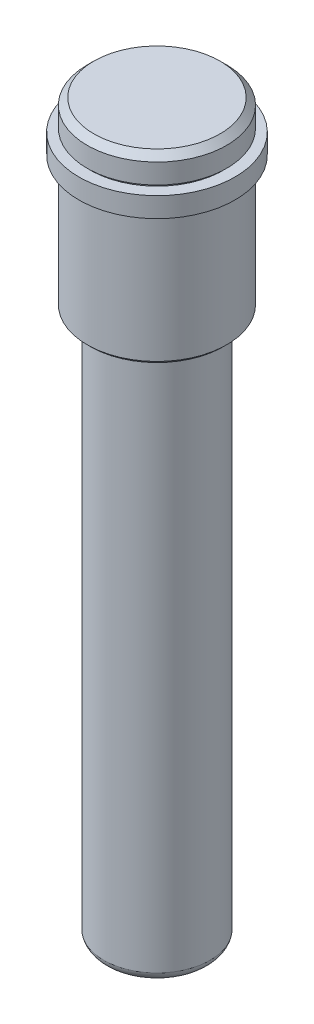
ISO-10303-21;
HEADER;
FILE_DESCRIPTION(('STEP AP214'),'2;1');
FILE_NAME('part.step','',(''),(''),'','','');
FILE_SCHEMA(('AUTOMOTIVE_DESIGN { 1 0 10303 214 1 1 1 1 }'));
ENDSEC;
DATA;
#1=APPLICATION_CONTEXT('core data for automotive mechanical design processes');
#2=APPLICATION_PROTOCOL_DEFINITION('international standard','automotive_design',2000,#1);
#3=PRODUCT_CONTEXT('',#1,'mechanical');
#4=PRODUCT('Part','Part','',(#3));
#5=PRODUCT_RELATED_PRODUCT_CATEGORY('part','',(#4));
#6=PRODUCT_DEFINITION_FORMATION('','',#4);
#7=PRODUCT_DEFINITION_CONTEXT('part definition',#1,'design');
#8=PRODUCT_DEFINITION('design','',#6,#7);
#9=PRODUCT_DEFINITION_SHAPE('','',#8);
#10=(LENGTH_UNIT() NAMED_UNIT(*) SI_UNIT(.MILLI.,.METRE.));
#11=(NAMED_UNIT(*) PLANE_ANGLE_UNIT() SI_UNIT($,.RADIAN.));
#12=(NAMED_UNIT(*) SI_UNIT($,.STERADIAN.) SOLID_ANGLE_UNIT());
#13=UNCERTAINTY_MEASURE_WITH_UNIT(LENGTH_MEASURE(1.E-05),#10,'distance_accuracy_value','');
#14=(GEOMETRIC_REPRESENTATION_CONTEXT(3) GLOBAL_UNCERTAINTY_ASSIGNED_CONTEXT((#13)) GLOBAL_UNIT_ASSIGNED_CONTEXT((#10,
#11,#12)) REPRESENTATION_CONTEXT('',''));
#15=CARTESIAN_POINT('',(0.,0.,0.));
#16=DIRECTION('',(0.,0.,1.));
#17=DIRECTION('',(1.,0.,0.));
#18=AXIS2_PLACEMENT_3D('',#15,#16,#17);
#19=CARTESIAN_POINT('',(0.,188.802213018916,0.));
#20=DIRECTION('',(0.,1.,0.));
#21=DIRECTION('',(-1.,0.,0.));
#22=AXIS2_PLACEMENT_3D('',#19,#20,#21);
#23=PLANE('',#22);
#24=CARTESIAN_POINT('',(0.,188.802213018916,0.));
#25=DIRECTION('',(0.,1.,0.));
#26=DIRECTION('',(-1.,0.,0.));
#27=AXIS2_PLACEMENT_3D('',#24,#25,#26);
#28=CIRCLE('',#27,19.);
#29=CARTESIAN_POINT('',(-19.,188.802213018916,0.));
#30=VERTEX_POINT('',#29);
#31=EDGE_CURVE('E10',#30,#30,#28,.T.);
#32=ORIENTED_EDGE('',*,*,#31,.T.);
#33=EDGE_LOOP('',(#32));
#34=FACE_BOUND('',#33,.T.);
#35=ADVANCED_FACE('F31',(#34),#23,.T.);
#36=CARTESIAN_POINT('',(0.,188.802213018916,0.));
#37=DIRECTION('',(0.,-1.,0.));
#38=DIRECTION('',(1.,0.,0.));
#39=AXIS2_PLACEMENT_3D('',#36,#37,#38);
#40=CONICAL_SURFACE('',#39,19.,0.785398163397447);
#41=CARTESIAN_POINT('',(0.,186.802213018916,0.));
#42=DIRECTION('',(0.,1.,0.));
#43=DIRECTION('',(-1.,0.,0.));
#44=AXIS2_PLACEMENT_3D('',#41,#42,#43);
#45=CIRCLE('',#44,21.);
#46=CARTESIAN_POINT('',(-21.,186.802213018916,0.));
#47=VERTEX_POINT('',#46);
#48=EDGE_CURVE('E37',#47,#47,#45,.T.);
#49=ORIENTED_EDGE('',*,*,#48,.T.);
#50=EDGE_LOOP('',(#49));
#51=FACE_BOUND('',#50,.T.);
#52=ORIENTED_EDGE('',*,*,#31,.F.);
#53=EDGE_LOOP('',(#52));
#54=FACE_BOUND('',#53,.T.);
#55=ADVANCED_FACE('F102',(#51,#54),#40,.T.);
#56=CARTESIAN_POINT('',(0.,188.802213018916,0.));
#57=DIRECTION('',(0.,1.,0.));
#58=DIRECTION('',(-1.,0.,0.));
#59=AXIS2_PLACEMENT_3D('',#56,#57,#58);
#60=CYLINDRICAL_SURFACE('',#59,21.);
#61=CARTESIAN_POINT('',(0.,180.802213018916,0.));
#62=DIRECTION('',(0.,1.,0.));
#63=DIRECTION('',(-1.,0.,0.));
#64=AXIS2_PLACEMENT_3D('',#61,#62,#63);
#65=CIRCLE('',#64,21.);
#66=CARTESIAN_POINT('',(-21.,180.802213018916,0.));
#67=VERTEX_POINT('',#66);
#68=EDGE_CURVE('E41',#67,#67,#65,.T.);
#69=ORIENTED_EDGE('',*,*,#68,.T.);
#70=EDGE_LOOP('',(#69));
#71=FACE_BOUND('',#70,.T.);
#72=ORIENTED_EDGE('',*,*,#48,.F.);
#73=EDGE_LOOP('',(#72));
#74=FACE_BOUND('',#73,.T.);
#75=ADVANCED_FACE('F106',(#71,#74),#60,.T.);
#76=CARTESIAN_POINT('',(-21.,180.802213018916,0.));
#77=DIRECTION('',(0.,-1.,0.));
#78=DIRECTION('',(1.,0.,0.));
#79=AXIS2_PLACEMENT_3D('',#76,#77,#78);
#80=PLANE('',#79);
#81=CARTESIAN_POINT('',(0.,180.802213018916,0.));
#82=DIRECTION('',(0.,1.,0.));
#83=DIRECTION('',(-1.,0.,0.));
#84=AXIS2_PLACEMENT_3D('',#81,#82,#83);
#85=CIRCLE('',#84,20.);
#86=CARTESIAN_POINT('',(-20.,180.802213018916,0.));
#87=VERTEX_POINT('',#86);
#88=EDGE_CURVE('E45',#87,#87,#85,.T.);
#89=ORIENTED_EDGE('',*,*,#88,.T.);
#90=EDGE_LOOP('',(#89));
#91=FACE_BOUND('',#90,.T.);
#92=ORIENTED_EDGE('',*,*,#68,.F.);
#93=EDGE_LOOP('',(#92));
#94=FACE_BOUND('',#93,.T.);
#95=ADVANCED_FACE('F110',(#91,#94),#80,.T.);
#96=CARTESIAN_POINT('',(0.,188.802213018916,0.));
#97=DIRECTION('',(0.,1.,0.));
#98=DIRECTION('',(-1.,0.,0.));
#99=AXIS2_PLACEMENT_3D('',#96,#97,#98);
#100=CYLINDRICAL_SURFACE('',#99,20.);
#101=CARTESIAN_POINT('',(0.,179.802213018916,0.));
#102=DIRECTION('',(0.,1.,0.));
#103=DIRECTION('',(-1.,0.,0.));
#104=AXIS2_PLACEMENT_3D('',#101,#102,#103);
#105=CIRCLE('',#104,20.);
#106=CARTESIAN_POINT('',(-20.,179.802213018916,0.));
#107=VERTEX_POINT('',#106);
#108=EDGE_CURVE('E50',#107,#107,#105,.T.);
#109=ORIENTED_EDGE('',*,*,#108,.T.);
#110=EDGE_LOOP('',(#109));
#111=FACE_BOUND('',#110,.T.);
#112=ORIENTED_EDGE('',*,*,#88,.F.);
#113=EDGE_LOOP('',(#112));
#114=FACE_BOUND('',#113,.T.);
#115=ADVANCED_FACE('F117',(#111,#114),#100,.T.);
#116=CARTESIAN_POINT('',(-20.,179.802213018916,0.));
#117=DIRECTION('',(0.,1.,0.));
#118=DIRECTION('',(-1.,0.,0.));
#119=AXIS2_PLACEMENT_3D('',#116,#117,#118);
#120=PLANE('',#119);
#121=CARTESIAN_POINT('',(0.,179.802213018916,0.));
#122=DIRECTION('',(0.,1.,0.));
#123=DIRECTION('',(-1.,0.,0.));
#124=AXIS2_PLACEMENT_3D('',#121,#122,#123);
#125=CIRCLE('',#124,23.5);
#126=CARTESIAN_POINT('',(-23.5,179.802213018916,0.));
#127=VERTEX_POINT('',#126);
#128=EDGE_CURVE('E53',#127,#127,#125,.T.);
#129=ORIENTED_EDGE('',*,*,#128,.T.);
#130=EDGE_LOOP('',(#129));
#131=FACE_BOUND('',#130,.T.);
#132=ORIENTED_EDGE('',*,*,#108,.F.);
#133=EDGE_LOOP('',(#132));
#134=FACE_BOUND('',#133,.T.);
#135=ADVANCED_FACE('F121',(#131,#134),#120,.T.);
#136=CARTESIAN_POINT('',(0.,188.802213018916,0.));
#137=DIRECTION('',(0.,1.,0.));
#138=DIRECTION('',(-1.,0.,0.));
#139=AXIS2_PLACEMENT_3D('',#136,#137,#138);
#140=CYLINDRICAL_SURFACE('',#139,23.5);
#141=CARTESIAN_POINT('',(0.,173.802213018916,0.));
#142=DIRECTION('',(0.,1.,0.));
#143=DIRECTION('',(-1.,0.,0.));
#144=AXIS2_PLACEMENT_3D('',#141,#142,#143);
#145=CIRCLE('',#144,23.5);
#146=CARTESIAN_POINT('',(-23.5,173.802213018916,0.));
#147=VERTEX_POINT('',#146);
#148=EDGE_CURVE('E56',#147,#147,#145,.T.);
#149=ORIENTED_EDGE('',*,*,#148,.T.);
#150=EDGE_LOOP('',(#149));
#151=FACE_BOUND('',#150,.T.);
#152=ORIENTED_EDGE('',*,*,#128,.F.);
#153=EDGE_LOOP('',(#152));
#154=FACE_BOUND('',#153,.T.);
#155=ADVANCED_FACE('F125',(#151,#154),#140,.T.);
#156=CARTESIAN_POINT('',(-21.,173.802213018916,0.));
#157=DIRECTION('',(0.,-1.,0.));
#158=DIRECTION('',(1.,0.,0.));
#159=AXIS2_PLACEMENT_3D('',#156,#157,#158);
#160=PLANE('',#159);
#161=CARTESIAN_POINT('',(0.,173.802213018916,0.));
#162=DIRECTION('',(0.,1.,0.));
#163=DIRECTION('',(-1.,0.,0.));
#164=AXIS2_PLACEMENT_3D('',#161,#162,#163);
#165=CIRCLE('',#164,20.3);
#166=CARTESIAN_POINT('',(-20.3,173.802213018916,0.));
#167=VERTEX_POINT('',#166);
#168=EDGE_CURVE('E59',#167,#167,#165,.T.);
#169=ORIENTED_EDGE('',*,*,#168,.T.);
#170=EDGE_LOOP('',(#169));
#171=FACE_BOUND('',#170,.T.);
#172=ORIENTED_EDGE('',*,*,#148,.F.);
#173=EDGE_LOOP('',(#172));
#174=FACE_BOUND('',#173,.T.);
#175=ADVANCED_FACE('F129',(#171,#174),#160,.T.);
#176=CARTESIAN_POINT('',(0.,188.802213018916,0.));
#177=DIRECTION('',(0.,1.,0.));
#178=DIRECTION('',(-1.,0.,0.));
#179=AXIS2_PLACEMENT_3D('',#176,#177,#178);
#180=CYLINDRICAL_SURFACE('',#179,20.3);
#181=CARTESIAN_POINT('',(0.,173.102213018916,0.));
#182=DIRECTION('',(0.,1.,0.));
#183=DIRECTION('',(-1.,0.,0.));
#184=AXIS2_PLACEMENT_3D('',#181,#182,#183);
#185=CIRCLE('',#184,20.3);
#186=CARTESIAN_POINT('',(-20.3,173.102213018916,0.));
#187=VERTEX_POINT('',#186);
#188=EDGE_CURVE('E62',#187,#187,#185,.T.);
#189=ORIENTED_EDGE('',*,*,#188,.T.);
#190=EDGE_LOOP('',(#189));
#191=FACE_BOUND('',#190,.T.);
#192=ORIENTED_EDGE('',*,*,#168,.F.);
#193=EDGE_LOOP('',(#192));
#194=FACE_BOUND('',#193,.T.);
#195=ADVANCED_FACE('F133',(#191,#194),#180,.T.);
#196=CARTESIAN_POINT('',(-20.3,173.102213018916,0.));
#197=DIRECTION('',(0.,1.,0.));
#198=DIRECTION('',(-1.,0.,0.));
#199=AXIS2_PLACEMENT_3D('',#196,#197,#198);
#200=PLANE('',#199);
#201=CARTESIAN_POINT('',(0.,173.102213018916,0.));
#202=DIRECTION('',(0.,1.,0.));
#203=DIRECTION('',(-1.,0.,0.));
#204=AXIS2_PLACEMENT_3D('',#201,#202,#203);
#205=CIRCLE('',#204,21.);
#206=CARTESIAN_POINT('',(-21.,173.102213018916,0.));
#207=VERTEX_POINT('',#206);
#208=EDGE_CURVE('E65',#207,#207,#205,.T.);
#209=ORIENTED_EDGE('',*,*,#208,.T.);
#210=EDGE_LOOP('',(#209));
#211=FACE_BOUND('',#210,.T.);
#212=ORIENTED_EDGE('',*,*,#188,.F.);
#213=EDGE_LOOP('',(#212));
#214=FACE_BOUND('',#213,.T.);
#215=ADVANCED_FACE('F137',(#211,#214),#200,.T.);
#216=CARTESIAN_POINT('',(0.,188.802213018916,0.));
#217=DIRECTION('',(0.,1.,0.));
#218=DIRECTION('',(-1.,0.,0.));
#219=AXIS2_PLACEMENT_3D('',#216,#217,#218);
#220=CYLINDRICAL_SURFACE('',#219,21.);
#221=CARTESIAN_POINT('',(0.,134.802213018916,0.));
#222=DIRECTION('',(0.,1.,0.));
#223=DIRECTION('',(-1.,0.,0.));
#224=AXIS2_PLACEMENT_3D('',#221,#222,#223);
#225=CIRCLE('',#224,21.);
#226=CARTESIAN_POINT('',(-21.,134.802213018916,0.));
#227=VERTEX_POINT('',#226);
#228=EDGE_CURVE('E68',#227,#227,#225,.T.);
#229=ORIENTED_EDGE('',*,*,#228,.T.);
#230=EDGE_LOOP('',(#229));
#231=FACE_BOUND('',#230,.T.);
#232=ORIENTED_EDGE('',*,*,#208,.F.);
#233=EDGE_LOOP('',(#232));
#234=FACE_BOUND('',#233,.T.);
#235=ADVANCED_FACE('F141',(#231,#234),#220,.T.);
#236=CARTESIAN_POINT('',(0.,134.802213018916,0.));
#237=DIRECTION('',(0.,1.,0.));
#238=DIRECTION('',(-1.,0.,0.));
#239=AXIS2_PLACEMENT_3D('',#236,#237,#238);
#240=CONICAL_SURFACE('',#239,21.,0.785398163397448);
#241=CARTESIAN_POINT('',(0.,133.802213018916,0.));
#242=DIRECTION('',(0.,1.,0.));
#243=DIRECTION('',(-1.,0.,0.));
#244=AXIS2_PLACEMENT_3D('',#241,#242,#243);
#245=CIRCLE('',#244,20.);
#246=CARTESIAN_POINT('',(-20.,133.802213018916,0.));
#247=VERTEX_POINT('',#246);
#248=EDGE_CURVE('E71',#247,#247,#245,.T.);
#249=ORIENTED_EDGE('',*,*,#248,.T.);
#250=EDGE_LOOP('',(#249));
#251=FACE_BOUND('',#250,.T.);
#252=ORIENTED_EDGE('',*,*,#228,.F.);
#253=EDGE_LOOP('',(#252));
#254=FACE_BOUND('',#253,.T.);
#255=ADVANCED_FACE('F145',(#251,#254),#240,.T.);
#256=CARTESIAN_POINT('',(-20.,133.802213018916,0.));
#257=DIRECTION('',(0.,-1.,0.));
#258=DIRECTION('',(1.,0.,0.));
#259=AXIS2_PLACEMENT_3D('',#256,#257,#258);
#260=PLANE('',#259);
#261=CARTESIAN_POINT('',(0.,133.802213018916,0.));
#262=DIRECTION('',(0.,1.,0.));
#263=DIRECTION('',(-1.,0.,0.));
#264=AXIS2_PLACEMENT_3D('',#261,#262,#263);
#265=CIRCLE('',#264,15.);
#266=CARTESIAN_POINT('',(-15.,133.802213018916,0.));
#267=VERTEX_POINT('',#266);
#268=EDGE_CURVE('E74',#267,#267,#265,.T.);
#269=ORIENTED_EDGE('',*,*,#268,.T.);
#270=EDGE_LOOP('',(#269));
#271=FACE_BOUND('',#270,.T.);
#272=ORIENTED_EDGE('',*,*,#248,.F.);
#273=EDGE_LOOP('',(#272));
#274=FACE_BOUND('',#273,.T.);
#275=ADVANCED_FACE('F149',(#271,#274),#260,.T.);
#276=CARTESIAN_POINT('',(0.,188.802213018916,0.));
#277=DIRECTION('',(0.,1.,0.));
#278=DIRECTION('',(-1.,0.,0.));
#279=AXIS2_PLACEMENT_3D('',#276,#277,#278);
#280=CYLINDRICAL_SURFACE('',#279,15.);
#281=CARTESIAN_POINT('',(0.,132.802213018916,0.));
#282=DIRECTION('',(0.,1.,0.));
#283=DIRECTION('',(-1.,0.,0.));
#284=AXIS2_PLACEMENT_3D('',#281,#282,#283);
#285=CIRCLE('',#284,15.);
#286=CARTESIAN_POINT('',(-15.,132.802213018916,0.));
#287=VERTEX_POINT('',#286);
#288=EDGE_CURVE('E77',#287,#287,#285,.T.);
#289=ORIENTED_EDGE('',*,*,#288,.T.);
#290=EDGE_LOOP('',(#289));
#291=FACE_BOUND('',#290,.T.);
#292=ORIENTED_EDGE('',*,*,#268,.F.);
#293=EDGE_LOOP('',(#292));
#294=FACE_BOUND('',#293,.T.);
#295=ADVANCED_FACE('F153',(#291,#294),#280,.T.);
#296=CARTESIAN_POINT('',(-15.,132.802213018916,0.));
#297=DIRECTION('',(0.,1.,0.));
#298=DIRECTION('',(-1.,0.,0.));
#299=AXIS2_PLACEMENT_3D('',#296,#297,#298);
#300=PLANE('',#299);
#301=CARTESIAN_POINT('',(0.,132.802213018916,0.));
#302=DIRECTION('',(0.,1.,0.));
#303=DIRECTION('',(-1.,0.,0.));
#304=AXIS2_PLACEMENT_3D('',#301,#302,#303);
#305=CIRCLE('',#304,16.);
#306=CARTESIAN_POINT('',(-16.,132.802213018916,0.));
#307=VERTEX_POINT('',#306);
#308=EDGE_CURVE('E80',#307,#307,#305,.T.);
#309=ORIENTED_EDGE('',*,*,#308,.T.);
#310=EDGE_LOOP('',(#309));
#311=FACE_BOUND('',#310,.T.);
#312=ORIENTED_EDGE('',*,*,#288,.F.);
#313=EDGE_LOOP('',(#312));
#314=FACE_BOUND('',#313,.T.);
#315=ADVANCED_FACE('F157',(#311,#314),#300,.T.);
#316=CARTESIAN_POINT('',(0.,188.802213018916,0.));
#317=DIRECTION('',(0.,1.,0.));
#318=DIRECTION('',(-1.,0.,0.));
#319=AXIS2_PLACEMENT_3D('',#316,#317,#318);
#320=CYLINDRICAL_SURFACE('',#319,16.);
#321=CARTESIAN_POINT('',(0.,-28.1977869810839,0.));
#322=DIRECTION('',(0.,1.,0.));
#323=DIRECTION('',(-1.,0.,0.));
#324=AXIS2_PLACEMENT_3D('',#321,#322,#323);
#325=CIRCLE('',#324,16.);
#326=CARTESIAN_POINT('',(-16.,-28.1977869810839,0.));
#327=VERTEX_POINT('',#326);
#328=EDGE_CURVE('E83',#327,#327,#325,.T.);
#329=ORIENTED_EDGE('',*,*,#328,.T.);
#330=EDGE_LOOP('',(#329));
#331=FACE_BOUND('',#330,.T.);
#332=ORIENTED_EDGE('',*,*,#308,.F.);
#333=EDGE_LOOP('',(#332));
#334=FACE_BOUND('',#333,.T.);
#335=ADVANCED_FACE('F99',(#331,#334),#320,.T.);
#336=CARTESIAN_POINT('',(0.,-27.3802541844677,0.));
#337=DIRECTION('',(0.,1.,0.));
#338=DIRECTION('',(-1.,0.,0.));
#339=AXIS2_PLACEMENT_3D('',#336,#337,#338);
#340=TOROIDAL_SURFACE('',#339,12.0844361674904,4.00000000000001);
#341=CARTESIAN_POINT('',(0.,-31.1977869810839,0.));
#342=DIRECTION('',(0.,1.,0.));
#343=DIRECTION('',(-1.,0.,0.));
#344=AXIS2_PLACEMENT_3D('',#341,#342,#343);
#345=CIRCLE('',#344,13.278774204547);
#346=CARTESIAN_POINT('',(-13.278774204547,-31.1977869810839,0.));
#347=VERTEX_POINT('',#346);
#348=EDGE_CURVE('E86',#347,#347,#345,.T.);
#349=ORIENTED_EDGE('',*,*,#348,.T.);
#350=EDGE_LOOP('',(#349));
#351=FACE_BOUND('',#350,.T.);
#352=ORIENTED_EDGE('',*,*,#328,.F.);
#353=EDGE_LOOP('',(#352));
#354=FACE_BOUND('',#353,.T.);
#355=ADVANCED_FACE('F90',(#351,#354),#340,.T.);
#356=CARTESIAN_POINT('',(-13.278774204547,-31.1977869810839,0.));
#357=DIRECTION('',(0.,-1.,0.));
#358=DIRECTION('',(1.,0.,0.));
#359=AXIS2_PLACEMENT_3D('',#356,#357,#358);
#360=PLANE('',#359);
#361=ORIENTED_EDGE('',*,*,#348,.F.);
#362=EDGE_LOOP('',(#361));
#363=FACE_BOUND('',#362,.T.);
#364=ADVANCED_FACE('F93',(#363),#360,.T.);
#365=CLOSED_SHELL('',(#35,#55,#75,#95,#115,#135,#155,#175,#195,#215,#235,#255,#275,#295,#315,
#335,#355,#364));
#366=MANIFOLD_SOLID_BREP('B2',#365);
#367=ADVANCED_BREP_SHAPE_REPRESENTATION('',(#18,#366),#14);
#368=SHAPE_DEFINITION_REPRESENTATION(#9,#367);
ENDSEC;
END-ISO-10303-21;
